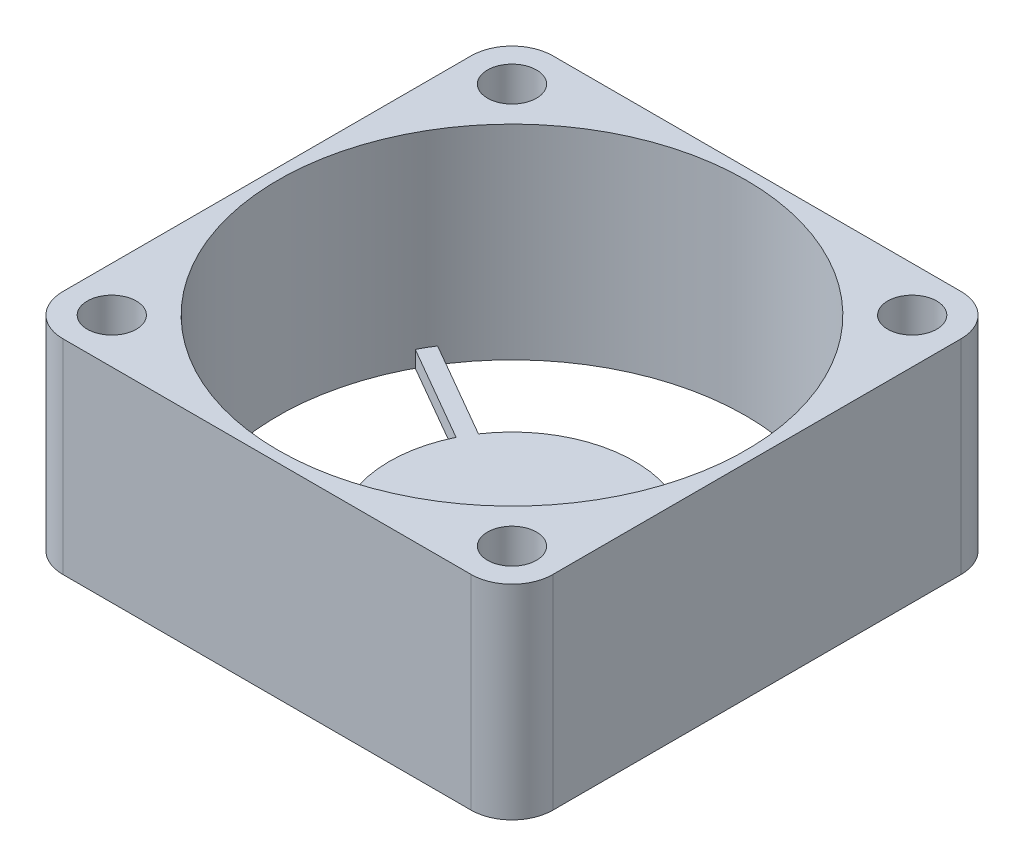
ISO-10303-21;
HEADER;
FILE_DESCRIPTION(('STEP AP214'),'2;1');
FILE_NAME('part.step','',(''),(''),'','','');
FILE_SCHEMA(('AUTOMOTIVE_DESIGN { 1 0 10303 214 1 1 1 1 }'));
ENDSEC;
DATA;
#1=APPLICATION_CONTEXT('core data for automotive mechanical design processes');
#2=APPLICATION_PROTOCOL_DEFINITION('international standard','automotive_design',2000,#1);
#3=PRODUCT_CONTEXT('',#1,'mechanical');
#4=PRODUCT('Part','Part','',(#3));
#5=PRODUCT_RELATED_PRODUCT_CATEGORY('part','',(#4));
#6=PRODUCT_DEFINITION_FORMATION('','',#4);
#7=PRODUCT_DEFINITION_CONTEXT('part definition',#1,'design');
#8=PRODUCT_DEFINITION('design','',#6,#7);
#9=PRODUCT_DEFINITION_SHAPE('','',#8);
#10=(LENGTH_UNIT() NAMED_UNIT(*) SI_UNIT(.MILLI.,.METRE.));
#11=(NAMED_UNIT(*) PLANE_ANGLE_UNIT() SI_UNIT($,.RADIAN.));
#12=(NAMED_UNIT(*) SI_UNIT($,.STERADIAN.) SOLID_ANGLE_UNIT());
#13=UNCERTAINTY_MEASURE_WITH_UNIT(LENGTH_MEASURE(1.E-05),#10,'distance_accuracy_value','');
#14=(GEOMETRIC_REPRESENTATION_CONTEXT(3) GLOBAL_UNCERTAINTY_ASSIGNED_CONTEXT((#13)) GLOBAL_UNIT_ASSIGNED_CONTEXT((#10,
#11,#12)) REPRESENTATION_CONTEXT('',''));
#15=CARTESIAN_POINT('',(0.,0.,0.));
#16=DIRECTION('',(0.,0.,1.));
#17=DIRECTION('',(1.,0.,0.));
#18=AXIS2_PLACEMENT_3D('',#15,#16,#17);
#19=CARTESIAN_POINT('',(0.,35.4678252036913,0.));
#20=DIRECTION('',(0.,-1.,0.));
#21=DIRECTION('',(0.,0.,1.));
#22=AXIS2_PLACEMENT_3D('',#19,#20,#21);
#23=CYLINDRICAL_SURFACE('',#22,14.3241161390704);
#24=CARTESIAN_POINT('',(0.,1.,0.));
#25=DIRECTION('',(0.,-1.,0.));
#26=DIRECTION('',(0.,0.,-1.));
#27=AXIS2_PLACEMENT_3D('',#24,#25,#26);
#28=CIRCLE('',#27,14.3241161390704);
#29=CARTESIAN_POINT('',(0.5,1.,14.3153869373335));
#30=VERTEX_POINT('',#29);
#31=CARTESIAN_POINT('',(-0.5,1.,14.3153869373335));
#32=VERTEX_POINT('',#31);
#33=EDGE_CURVE('E224',#30,#32,#28,.T.);
#34=ORIENTED_EDGE('',*,*,#33,.T.);
#35=DIRECTION('',(0.,-1.,0.));
#36=VECTOR('',#35,1.);
#37=CARTESIAN_POINT('',(-0.5,35.4678252036913,14.3153869373335));
#38=LINE('',#37,#36);
#39=CARTESIAN_POINT('',(-0.5,0.,14.3153869373335));
#40=VERTEX_POINT('',#39);
#41=EDGE_CURVE('E226',#32,#40,#38,.T.);
#42=ORIENTED_EDGE('',*,*,#41,.T.);
#43=CARTESIAN_POINT('',(0.,0.,0.));
#44=DIRECTION('',(0.,-1.,0.));
#45=DIRECTION('',(0.,0.,-1.));
#46=AXIS2_PLACEMENT_3D('',#43,#44,#45);
#47=CIRCLE('',#46,14.3241161390704);
#48=CARTESIAN_POINT('',(0.5,0.,14.3153869373335));
#49=VERTEX_POINT('',#48);
#50=EDGE_CURVE('E204',#49,#40,#47,.T.);
#51=ORIENTED_EDGE('',*,*,#50,.F.);
#52=DIRECTION('',(0.,-1.,0.));
#53=VECTOR('',#52,1.);
#54=CARTESIAN_POINT('',(0.5,35.4678252036913,14.3153869373335));
#55=LINE('',#54,#53);
#56=EDGE_CURVE('E60',#30,#49,#55,.T.);
#57=ORIENTED_EDGE('',*,*,#56,.F.);
#58=EDGE_LOOP('',(#34,#42,#51,#57));
#59=FACE_BOUND('',#58,.T.);
#60=ADVANCED_FACE('F56',(#59),#23,.T.);
#61=CARTESIAN_POINT('',(-0.5,35.4678252036913,0.));
#62=DIRECTION('',(-1.,0.,0.));
#63=DIRECTION('',(0.,0.,-1.));
#64=AXIS2_PLACEMENT_3D('',#61,#62,#63);
#65=PLANE('',#64);
#66=DIRECTION('',(0.,-1.,0.));
#67=VECTOR('',#66,1.);
#68=CARTESIAN_POINT('',(-0.5,35.4678252036913,7.48331477354788));
#69=LINE('',#68,#67);
#70=CARTESIAN_POINT('',(-0.5,1.,7.48331477354788));
#71=VERTEX_POINT('',#70);
#72=CARTESIAN_POINT('',(-0.5,0.,7.48331477354788));
#73=VERTEX_POINT('',#72);
#74=EDGE_CURVE('E202',#71,#73,#69,.T.);
#75=ORIENTED_EDGE('',*,*,#74,.T.);
#76=DIRECTION('',(0.,0.,1.));
#77=VECTOR('',#76,1.);
#78=CARTESIAN_POINT('',(-0.5,0.,0.));
#79=LINE('',#78,#77);
#80=EDGE_CURVE('E128',#73,#40,#79,.T.);
#81=ORIENTED_EDGE('',*,*,#80,.T.);
#82=ORIENTED_EDGE('',*,*,#41,.F.);
#83=DIRECTION('',(0.,0.,1.));
#84=VECTOR('',#83,1.);
#85=CARTESIAN_POINT('',(-0.5,1.,0.));
#86=LINE('',#85,#84);
#87=EDGE_CURVE('E137',#71,#32,#86,.T.);
#88=ORIENTED_EDGE('',*,*,#87,.F.);
#89=EDGE_LOOP('',(#75,#81,#82,#88));
#90=FACE_BOUND('',#89,.T.);
#91=ADVANCED_FACE('F269',(#90),#65,.T.);
#92=CARTESIAN_POINT('',(0.,35.4678252036913,0.));
#93=DIRECTION('',(0.,-1.,0.));
#94=DIRECTION('',(0.,0.,1.));
#95=AXIS2_PLACEMENT_3D('',#92,#93,#94);
#96=CYLINDRICAL_SURFACE('',#95,7.5);
#97=CARTESIAN_POINT('',(0.,1.,0.));
#98=DIRECTION('',(0.,-1.,0.));
#99=DIRECTION('',(0.,0.,-1.));
#100=AXIS2_PLACEMENT_3D('',#97,#98,#99);
#101=CIRCLE('',#100,7.5);
#102=CARTESIAN_POINT('',(-6.73074069840789,1.,-3.30864468488166));
#103=VERTEX_POINT('',#102);
#104=EDGE_CURVE('E221',#71,#103,#101,.T.);
#105=ORIENTED_EDGE('',*,*,#104,.T.);
#106=DIRECTION('',(0.,-1.,0.));
#107=VECTOR('',#106,1.);
#108=CARTESIAN_POINT('',(-6.73074069840789,35.4678252036913,-3.30864468488166));
#109=LINE('',#108,#107);
#110=CARTESIAN_POINT('',(-6.73074069840789,0.,-3.30864468488166));
#111=VERTEX_POINT('',#110);
#112=EDGE_CURVE('E199',#103,#111,#109,.T.);
#113=ORIENTED_EDGE('',*,*,#112,.T.);
#114=CARTESIAN_POINT('',(0.,0.,0.));
#115=DIRECTION('',(0.,-1.,0.));
#116=DIRECTION('',(0.,0.,-1.));
#117=AXIS2_PLACEMENT_3D('',#114,#115,#116);
#118=CIRCLE('',#117,7.5);
#119=EDGE_CURVE('E175',#73,#111,#118,.T.);
#120=ORIENTED_EDGE('',*,*,#119,.F.);
#121=ORIENTED_EDGE('',*,*,#74,.F.);
#122=EDGE_LOOP('',(#105,#113,#120,#121));
#123=FACE_BOUND('',#122,.T.);
#124=ADVANCED_FACE('F268',(#123),#96,.T.);
#125=CARTESIAN_POINT('',(-0.249999999999996,35.4678252036913,0.433012701892222));
#126=DIRECTION('',(0.499999999999992,0.,-0.866025403784443));
#127=DIRECTION('',(0.866025403784443,0.,0.499999999999992));
#128=AXIS2_PLACEMENT_3D('',#125,#126,#127);
#129=PLANE('',#128);
#130=DIRECTION('',(-0.866025403784443,0.,-0.499999999999992));
#131=VECTOR('',#130,1.);
#132=CARTESIAN_POINT('',(-0.249999999999996,1.,0.433012701892222));
#133=LINE('',#132,#131);
#134=CARTESIAN_POINT('',(-12.6474887527348,1.,-6.7246807667744));
#135=VERTEX_POINT('',#134);
#136=EDGE_CURVE('E218',#103,#135,#133,.T.);
#137=ORIENTED_EDGE('',*,*,#136,.T.);
#138=DIRECTION('',(0.,-1.,0.));
#139=VECTOR('',#138,1.);
#140=CARTESIAN_POINT('',(-12.6474887527348,35.4678252036913,-6.7246807667744));
#141=LINE('',#140,#139);
#142=CARTESIAN_POINT('',(-12.6474887527348,0.,-6.7246807667744));
#143=VERTEX_POINT('',#142);
#144=EDGE_CURVE('E196',#135,#143,#141,.T.);
#145=ORIENTED_EDGE('',*,*,#144,.T.);
#146=DIRECTION('',(-0.866025403784443,0.,-0.499999999999992));
#147=VECTOR('',#146,1.);
#148=CARTESIAN_POINT('',(-0.249999999999996,0.,0.433012701892222));
#149=LINE('',#148,#147);
#150=EDGE_CURVE('E197',#111,#143,#149,.T.);
#151=ORIENTED_EDGE('',*,*,#150,.F.);
#152=ORIENTED_EDGE('',*,*,#112,.F.);
#153=EDGE_LOOP('',(#137,#145,#151,#152));
#154=FACE_BOUND('',#153,.T.);
#155=ADVANCED_FACE('F265',(#154),#129,.F.);
#156=CARTESIAN_POINT('',(0.,35.4678252036913,0.));
#157=DIRECTION('',(0.,-1.,0.));
#158=DIRECTION('',(0.,0.,1.));
#159=AXIS2_PLACEMENT_3D('',#156,#157,#158);
#160=CYLINDRICAL_SURFACE('',#159,14.3241161390704);
#161=CARTESIAN_POINT('',(0.,1.,0.));
#162=DIRECTION('',(0.,-1.,0.));
#163=DIRECTION('',(0.,0.,-1.));
#164=AXIS2_PLACEMENT_3D('',#161,#162,#163);
#165=CIRCLE('',#164,14.3241161390704);
#166=CARTESIAN_POINT('',(-12.1474887527348,1.,-7.59070617055884));
#167=VERTEX_POINT('',#166);
#168=EDGE_CURVE('E213',#135,#167,#165,.T.);
#169=ORIENTED_EDGE('',*,*,#168,.T.);
#170=DIRECTION('',(0.,-1.,0.));
#171=VECTOR('',#170,1.);
#172=CARTESIAN_POINT('',(-12.1474887527348,35.4678252036913,-7.59070617055884));
#173=LINE('',#172,#171);
#174=CARTESIAN_POINT('',(-12.1474887527348,0.,-7.59070617055884));
#175=VERTEX_POINT('',#174);
#176=EDGE_CURVE('E215',#167,#175,#173,.T.);
#177=ORIENTED_EDGE('',*,*,#176,.T.);
#178=CARTESIAN_POINT('',(0.,0.,0.));
#179=DIRECTION('',(0.,-1.,0.));
#180=DIRECTION('',(0.,0.,-1.));
#181=AXIS2_PLACEMENT_3D('',#178,#179,#180);
#182=CIRCLE('',#181,14.3241161390704);
#183=EDGE_CURVE('E192',#143,#175,#182,.T.);
#184=ORIENTED_EDGE('',*,*,#183,.F.);
#185=ORIENTED_EDGE('',*,*,#144,.F.);
#186=EDGE_LOOP('',(#169,#177,#184,#185));
#187=FACE_BOUND('',#186,.T.);
#188=ADVANCED_FACE('F262',(#187),#160,.T.);
#189=CARTESIAN_POINT('',(0.249999999999996,35.4678252036913,-0.433012701892222));
#190=DIRECTION('',(0.499999999999992,0.,-0.866025403784443));
#191=DIRECTION('',(0.866025403784443,0.,0.499999999999992));
#192=AXIS2_PLACEMENT_3D('',#189,#190,#191);
#193=PLANE('',#192);
#194=DIRECTION('',(0.,-1.,0.));
#195=VECTOR('',#194,1.);
#196=CARTESIAN_POINT('',(-6.2307406984079,35.4678252036913,-4.1746700886661));
#197=LINE('',#196,#195);
#198=CARTESIAN_POINT('',(-6.2307406984079,1.,-4.1746700886661));
#199=VERTEX_POINT('',#198);
#200=CARTESIAN_POINT('',(-6.2307406984079,0.,-4.1746700886661));
#201=VERTEX_POINT('',#200);
#202=EDGE_CURVE('E239',#199,#201,#197,.T.);
#203=ORIENTED_EDGE('',*,*,#202,.T.);
#204=DIRECTION('',(-0.866025403784443,0.,-0.499999999999992));
#205=VECTOR('',#204,1.);
#206=CARTESIAN_POINT('',(0.249999999999996,0.,-0.433012701892222));
#207=LINE('',#206,#205);
#208=EDGE_CURVE('E181',#201,#175,#207,.T.);
#209=ORIENTED_EDGE('',*,*,#208,.T.);
#210=ORIENTED_EDGE('',*,*,#176,.F.);
#211=DIRECTION('',(-0.866025403784443,0.,-0.499999999999992));
#212=VECTOR('',#211,1.);
#213=CARTESIAN_POINT('',(0.249999999999996,1.,-0.433012701892222));
#214=LINE('',#213,#212);
#215=EDGE_CURVE('E195',#199,#167,#214,.T.);
#216=ORIENTED_EDGE('',*,*,#215,.F.);
#217=EDGE_LOOP('',(#203,#209,#210,#216));
#218=FACE_BOUND('',#217,.T.);
#219=ADVANCED_FACE('F259',(#218),#193,.T.);
#220=CARTESIAN_POINT('',(0.,1.,0.));
#221=DIRECTION('',(0.,-1.,0.));
#222=DIRECTION('',(0.,0.,-1.));
#223=AXIS2_PLACEMENT_3D('',#220,#221,#222);
#224=CIRCLE('',#223,7.5);
#225=CARTESIAN_POINT('',(6.23074069840784,1.,-4.17467008866619));
#226=VERTEX_POINT('',#225);
#227=EDGE_CURVE('E210',#199,#226,#224,.T.);
#228=ORIENTED_EDGE('',*,*,#227,.T.);
#229=DIRECTION('',(0.,-1.,0.));
#230=VECTOR('',#229,1.);
#231=CARTESIAN_POINT('',(6.23074069840784,35.4678252036913,-4.17467008866619));
#232=LINE('',#231,#230);
#233=CARTESIAN_POINT('',(6.23074069840784,0.,-4.17467008866619));
#234=VERTEX_POINT('',#233);
#235=EDGE_CURVE('E190',#226,#234,#232,.T.);
#236=ORIENTED_EDGE('',*,*,#235,.T.);
#237=EDGE_CURVE('E174',#201,#234,#118,.T.);
#238=ORIENTED_EDGE('',*,*,#237,.F.);
#239=ORIENTED_EDGE('',*,*,#202,.F.);
#240=EDGE_LOOP('',(#228,#236,#238,#239));
#241=FACE_BOUND('',#240,.T.);
#242=ADVANCED_FACE('F255',(#241),#96,.T.);
#243=CARTESIAN_POINT('',(-0.250000000000002,35.4678252036913,-0.433012701892218));
#244=DIRECTION('',(0.500000000000004,0.,0.866025403784436));
#245=DIRECTION('',(-0.866025403784436,0.,0.500000000000004));
#246=AXIS2_PLACEMENT_3D('',#243,#244,#245);
#247=PLANE('',#246);
#248=DIRECTION('',(0.866025403784436,0.,-0.500000000000004));
#249=VECTOR('',#248,1.);
#250=CARTESIAN_POINT('',(-0.250000000000002,1.,-0.433012701892218));
#251=LINE('',#250,#249);
#252=CARTESIAN_POINT('',(12.1474887527347,1.,-7.59070617055901));
#253=VERTEX_POINT('',#252);
#254=EDGE_CURVE('E207',#226,#253,#251,.T.);
#255=ORIENTED_EDGE('',*,*,#254,.T.);
#256=DIRECTION('',(0.,-1.,0.));
#257=VECTOR('',#256,1.);
#258=CARTESIAN_POINT('',(12.1474887527347,35.4678252036913,-7.59070617055901));
#259=LINE('',#258,#257);
#260=CARTESIAN_POINT('',(12.1474887527347,0.,-7.59070617055901));
#261=VERTEX_POINT('',#260);
#262=EDGE_CURVE('E186',#253,#261,#259,.T.);
#263=ORIENTED_EDGE('',*,*,#262,.T.);
#264=DIRECTION('',(0.866025403784436,0.,-0.500000000000004));
#265=VECTOR('',#264,1.);
#266=CARTESIAN_POINT('',(-0.250000000000002,0.,-0.433012701892218));
#267=LINE('',#266,#265);
#268=EDGE_CURVE('E187',#234,#261,#267,.T.);
#269=ORIENTED_EDGE('',*,*,#268,.F.);
#270=ORIENTED_EDGE('',*,*,#235,.F.);
#271=EDGE_LOOP('',(#255,#263,#269,#270));
#272=FACE_BOUND('',#271,.T.);
#273=ADVANCED_FACE('F246',(#272),#247,.F.);
#274=CARTESIAN_POINT('',(0.,35.4678252036913,0.));
#275=DIRECTION('',(0.,-1.,0.));
#276=DIRECTION('',(0.,0.,1.));
#277=AXIS2_PLACEMENT_3D('',#274,#275,#276);
#278=CYLINDRICAL_SURFACE('',#277,14.3241161390704);
#279=CARTESIAN_POINT('',(0.,1.,0.));
#280=DIRECTION('',(0.,-1.,0.));
#281=DIRECTION('',(0.,0.,-1.));
#282=AXIS2_PLACEMENT_3D('',#279,#280,#281);
#283=CIRCLE('',#282,14.3241161390704);
#284=CARTESIAN_POINT('',(12.6474887527347,1.,-6.72468076677458));
#285=VERTEX_POINT('',#284);
#286=EDGE_CURVE('E65',#253,#285,#283,.T.);
#287=ORIENTED_EDGE('',*,*,#286,.T.);
#288=DIRECTION('',(0.,-1.,0.));
#289=VECTOR('',#288,1.);
#290=CARTESIAN_POINT('',(12.6474887527347,35.4678252036913,-6.72468076677458));
#291=LINE('',#290,#289);
#292=CARTESIAN_POINT('',(12.6474887527347,0.,-6.72468076677458));
#293=VERTEX_POINT('',#292);
#294=EDGE_CURVE('E164',#285,#293,#291,.T.);
#295=ORIENTED_EDGE('',*,*,#294,.T.);
#296=CARTESIAN_POINT('',(0.,0.,0.));
#297=DIRECTION('',(0.,-1.,0.));
#298=DIRECTION('',(0.,0.,-1.));
#299=AXIS2_PLACEMENT_3D('',#296,#297,#298);
#300=CIRCLE('',#299,14.3241161390704);
#301=EDGE_CURVE('E166',#261,#293,#300,.T.);
#302=ORIENTED_EDGE('',*,*,#301,.F.);
#303=ORIENTED_EDGE('',*,*,#262,.F.);
#304=EDGE_LOOP('',(#287,#295,#302,#303));
#305=FACE_BOUND('',#304,.T.);
#306=ADVANCED_FACE('F250',(#305),#278,.T.);
#307=CARTESIAN_POINT('',(0.250000000000003,35.4678252036913,0.433012701892219));
#308=DIRECTION('',(0.500000000000004,0.,0.866025403784436));
#309=DIRECTION('',(-0.866025403784436,0.,0.500000000000004));
#310=AXIS2_PLACEMENT_3D('',#307,#308,#309);
#311=PLANE('',#310);
#312=DIRECTION('',(0.,-1.,0.));
#313=VECTOR('',#312,1.);
#314=CARTESIAN_POINT('',(6.73074069840785,35.4678252036913,-3.30864468488175));
#315=LINE('',#314,#313);
#316=CARTESIAN_POINT('',(6.73074069840785,1.,-3.30864468488175));
#317=VERTEX_POINT('',#316);
#318=CARTESIAN_POINT('',(6.73074069840785,0.,-3.30864468488175));
#319=VERTEX_POINT('',#318);
#320=EDGE_CURVE('E162',#317,#319,#315,.T.);
#321=ORIENTED_EDGE('',*,*,#320,.T.);
#322=DIRECTION('',(0.866025403784436,0.,-0.500000000000004));
#323=VECTOR('',#322,1.);
#324=CARTESIAN_POINT('',(0.250000000000003,0.,0.433012701892219));
#325=LINE('',#324,#323);
#326=EDGE_CURVE('E178',#319,#293,#325,.T.);
#327=ORIENTED_EDGE('',*,*,#326,.T.);
#328=ORIENTED_EDGE('',*,*,#294,.F.);
#329=DIRECTION('',(0.866025403784436,0.,-0.500000000000004));
#330=VECTOR('',#329,1.);
#331=CARTESIAN_POINT('',(0.250000000000003,1.,0.433012701892219));
#332=LINE('',#331,#330);
#333=EDGE_CURVE('E154',#317,#285,#332,.T.);
#334=ORIENTED_EDGE('',*,*,#333,.F.);
#335=EDGE_LOOP('',(#321,#327,#328,#334));
#336=FACE_BOUND('',#335,.T.);
#337=ADVANCED_FACE('F161',(#336),#311,.T.);
#338=CARTESIAN_POINT('',(0.,1.,0.));
#339=DIRECTION('',(0.,-1.,0.));
#340=DIRECTION('',(0.,0.,-1.));
#341=AXIS2_PLACEMENT_3D('',#338,#339,#340);
#342=CIRCLE('',#341,7.5);
#343=CARTESIAN_POINT('',(0.5,1.,7.48331477354788));
#344=VERTEX_POINT('',#343);
#345=EDGE_CURVE('E12',#317,#344,#342,.T.);
#346=ORIENTED_EDGE('',*,*,#345,.T.);
#347=DIRECTION('',(0.,-1.,0.));
#348=VECTOR('',#347,1.);
#349=CARTESIAN_POINT('',(0.5,35.4678252036913,7.48331477354788));
#350=LINE('',#349,#348);
#351=CARTESIAN_POINT('',(0.5,0.,7.48331477354788));
#352=VERTEX_POINT('',#351);
#353=EDGE_CURVE('E172',#344,#352,#350,.T.);
#354=ORIENTED_EDGE('',*,*,#353,.T.);
#355=EDGE_CURVE('E169',#319,#352,#118,.T.);
#356=ORIENTED_EDGE('',*,*,#355,.F.);
#357=ORIENTED_EDGE('',*,*,#320,.F.);
#358=EDGE_LOOP('',(#346,#354,#356,#357));
#359=FACE_BOUND('',#358,.T.);
#360=ADVANCED_FACE('F168',(#359),#96,.T.);
#361=CARTESIAN_POINT('',(0.5,35.4678252036913,0.));
#362=DIRECTION('',(-1.,0.,0.));
#363=DIRECTION('',(0.,0.,-1.));
#364=AXIS2_PLACEMENT_3D('',#361,#362,#363);
#365=PLANE('',#364);
#366=DIRECTION('',(0.,0.,1.));
#367=VECTOR('',#366,1.);
#368=CARTESIAN_POINT('',(0.5,1.,0.));
#369=LINE('',#368,#367);
#370=EDGE_CURVE('E73',#344,#30,#369,.T.);
#371=ORIENTED_EDGE('',*,*,#370,.T.);
#372=ORIENTED_EDGE('',*,*,#56,.T.);
#373=DIRECTION('',(0.,0.,1.));
#374=VECTOR('',#373,1.);
#375=CARTESIAN_POINT('',(0.5,0.,0.));
#376=LINE('',#375,#374);
#377=EDGE_CURVE('E79',#352,#49,#376,.T.);
#378=ORIENTED_EDGE('',*,*,#377,.F.);
#379=ORIENTED_EDGE('',*,*,#353,.F.);
#380=EDGE_LOOP('',(#371,#372,#378,#379));
#381=FACE_BOUND('',#380,.T.);
#382=ADVANCED_FACE('F272',(#381),#365,.F.);
#383=CARTESIAN_POINT('',(0.,0.,0.));
#384=DIRECTION('',(0.,1.,0.));
#385=DIRECTION('',(0.,0.,-1.));
#386=AXIS2_PLACEMENT_3D('',#383,#384,#385);
#387=PLANE('',#386);
#388=ORIENTED_EDGE('',*,*,#50,.T.);
#389=ORIENTED_EDGE('',*,*,#80,.F.);
#390=ORIENTED_EDGE('',*,*,#119,.T.);
#391=ORIENTED_EDGE('',*,*,#150,.T.);
#392=ORIENTED_EDGE('',*,*,#183,.T.);
#393=ORIENTED_EDGE('',*,*,#208,.F.);
#394=ORIENTED_EDGE('',*,*,#237,.T.);
#395=ORIENTED_EDGE('',*,*,#268,.T.);
#396=ORIENTED_EDGE('',*,*,#301,.T.);
#397=ORIENTED_EDGE('',*,*,#326,.F.);
#398=ORIENTED_EDGE('',*,*,#355,.T.);
#399=ORIENTED_EDGE('',*,*,#377,.T.);
#400=EDGE_LOOP('',(#388,#389,#390,#391,#392,#393,#394,#395,#396,#397,#398,#399));
#401=FACE_BOUND('',#400,.T.);
#402=ADVANCED_FACE('F251',(#401),#387,.F.);
#403=CARTESIAN_POINT('',(0.,1.,0.));
#404=DIRECTION('',(0.,1.,0.));
#405=DIRECTION('',(0.,0.,-1.));
#406=AXIS2_PLACEMENT_3D('',#403,#404,#405);
#407=PLANE('',#406);
#408=ORIENTED_EDGE('',*,*,#370,.F.);
#409=ORIENTED_EDGE('',*,*,#345,.F.);
#410=ORIENTED_EDGE('',*,*,#333,.T.);
#411=ORIENTED_EDGE('',*,*,#286,.F.);
#412=ORIENTED_EDGE('',*,*,#254,.F.);
#413=ORIENTED_EDGE('',*,*,#227,.F.);
#414=ORIENTED_EDGE('',*,*,#215,.T.);
#415=ORIENTED_EDGE('',*,*,#168,.F.);
#416=ORIENTED_EDGE('',*,*,#136,.F.);
#417=ORIENTED_EDGE('',*,*,#104,.F.);
#418=ORIENTED_EDGE('',*,*,#87,.T.);
#419=ORIENTED_EDGE('',*,*,#33,.F.);
#420=EDGE_LOOP('',(#408,#409,#410,#411,#412,#413,#414,#415,#416,#417,#418,#419));
#421=FACE_BOUND('',#420,.T.);
#422=ADVANCED_FACE('F58',(#421),#407,.T.);
#423=CLOSED_SHELL('',(#60,#91,#124,#155,#188,#219,#242,#273,#306,#337,#360,#382,#402,#422));
#424=MANIFOLD_SOLID_BREP('B2',#423);
#425=CARTESIAN_POINT('',(15.,12.5,0.));
#426=DIRECTION('',(1.,0.,0.));
#427=DIRECTION('',(0.,0.,1.));
#428=AXIS2_PLACEMENT_3D('',#425,#426,#427);
#429=PLANE('',#428);
#430=DIRECTION('',(0.,0.,-1.));
#431=VECTOR('',#430,1.);
#432=CARTESIAN_POINT('',(15.,0.,0.));
#433=LINE('',#432,#431);
#434=CARTESIAN_POINT('',(15.,0.,12.5));
#435=VERTEX_POINT('',#434);
#436=CARTESIAN_POINT('',(15.,0.,-12.5));
#437=VERTEX_POINT('',#436);
#438=EDGE_CURVE('E502',#435,#437,#433,.T.);
#439=ORIENTED_EDGE('',*,*,#438,.T.);
#440=DIRECTION('',(0.,-1.,0.));
#441=VECTOR('',#440,1.);
#442=CARTESIAN_POINT('',(15.,0.,-12.5));
#443=LINE('',#442,#441);
#444=CARTESIAN_POINT('',(15.,12.5,-12.5));
#445=VERTEX_POINT('',#444);
#446=EDGE_CURVE('E521',#445,#437,#443,.T.);
#447=ORIENTED_EDGE('',*,*,#446,.F.);
#448=DIRECTION('',(0.,0.,-1.));
#449=VECTOR('',#448,1.);
#450=CARTESIAN_POINT('',(15.,12.5,0.));
#451=LINE('',#450,#449);
#452=CARTESIAN_POINT('',(15.,12.5,12.5));
#453=VERTEX_POINT('',#452);
#454=EDGE_CURVE('E729',#453,#445,#451,.T.);
#455=ORIENTED_EDGE('',*,*,#454,.F.);
#456=DIRECTION('',(0.,-1.,0.));
#457=VECTOR('',#456,1.);
#458=CARTESIAN_POINT('',(15.,12.5,12.5));
#459=LINE('',#458,#457);
#460=EDGE_CURVE('E524',#435,#453,#459,.F.);
#461=ORIENTED_EDGE('',*,*,#460,.F.);
#462=EDGE_LOOP('',(#439,#447,#455,#461));
#463=FACE_BOUND('',#462,.T.);
#464=ADVANCED_FACE('F406',(#463),#429,.T.);
#465=CARTESIAN_POINT('',(0.,12.5,15.));
#466=DIRECTION('',(0.,0.,1.));
#467=DIRECTION('',(-1.,0.,0.));
#468=AXIS2_PLACEMENT_3D('',#465,#466,#467);
#469=PLANE('',#468);
#470=DIRECTION('',(1.,0.,0.));
#471=VECTOR('',#470,1.);
#472=CARTESIAN_POINT('',(0.,0.,15.));
#473=LINE('',#472,#471);
#474=CARTESIAN_POINT('',(-12.5,0.,15.));
#475=VERTEX_POINT('',#474);
#476=CARTESIAN_POINT('',(12.5,0.,15.));
#477=VERTEX_POINT('',#476);
#478=EDGE_CURVE('E479',#475,#477,#473,.T.);
#479=ORIENTED_EDGE('',*,*,#478,.T.);
#480=DIRECTION('',(0.,-1.,0.));
#481=VECTOR('',#480,1.);
#482=CARTESIAN_POINT('',(12.5,12.5,15.));
#483=LINE('',#482,#481);
#484=CARTESIAN_POINT('',(12.5,12.5,15.));
#485=VERTEX_POINT('',#484);
#486=EDGE_CURVE('E483',#485,#477,#483,.T.);
#487=ORIENTED_EDGE('',*,*,#486,.F.);
#488=DIRECTION('',(1.,0.,0.));
#489=VECTOR('',#488,1.);
#490=CARTESIAN_POINT('',(0.,12.5,15.));
#491=LINE('',#490,#489);
#492=CARTESIAN_POINT('',(-12.5,12.5,15.));
#493=VERTEX_POINT('',#492);
#494=EDGE_CURVE('E534',#493,#485,#491,.T.);
#495=ORIENTED_EDGE('',*,*,#494,.F.);
#496=DIRECTION('',(0.,-1.,0.));
#497=VECTOR('',#496,1.);
#498=CARTESIAN_POINT('',(-12.5,12.5,15.));
#499=LINE('',#498,#497);
#500=EDGE_CURVE('E514',#475,#493,#499,.F.);
#501=ORIENTED_EDGE('',*,*,#500,.F.);
#502=EDGE_LOOP('',(#479,#487,#495,#501));
#503=FACE_BOUND('',#502,.T.);
#504=ADVANCED_FACE('F568',(#503),#469,.T.);
#505=CARTESIAN_POINT('',(-15.,12.5,0.));
#506=DIRECTION('',(1.,0.,0.));
#507=DIRECTION('',(0.,0.,1.));
#508=AXIS2_PLACEMENT_3D('',#505,#506,#507);
#509=PLANE('',#508);
#510=DIRECTION('',(0.,0.,-1.));
#511=VECTOR('',#510,1.);
#512=CARTESIAN_POINT('',(-15.,12.5,0.));
#513=LINE('',#512,#511);
#514=CARTESIAN_POINT('',(-15.,12.5,12.5));
#515=VERTEX_POINT('',#514);
#516=CARTESIAN_POINT('',(-15.,12.5,-12.5));
#517=VERTEX_POINT('',#516);
#518=EDGE_CURVE('E532',#515,#517,#513,.T.);
#519=ORIENTED_EDGE('',*,*,#518,.T.);
#520=DIRECTION('',(0.,-1.,0.));
#521=VECTOR('',#520,1.);
#522=CARTESIAN_POINT('',(-15.,12.5,-12.5));
#523=LINE('',#522,#521);
#524=CARTESIAN_POINT('',(-15.,0.,-12.5));
#525=VERTEX_POINT('',#524);
#526=EDGE_CURVE('E494',#525,#517,#523,.F.);
#527=ORIENTED_EDGE('',*,*,#526,.F.);
#528=DIRECTION('',(0.,0.,-1.));
#529=VECTOR('',#528,1.);
#530=CARTESIAN_POINT('',(-15.,0.,0.));
#531=LINE('',#530,#529);
#532=CARTESIAN_POINT('',(-15.,0.,12.5));
#533=VERTEX_POINT('',#532);
#534=EDGE_CURVE('E476',#533,#525,#531,.T.);
#535=ORIENTED_EDGE('',*,*,#534,.F.);
#536=DIRECTION('',(0.,-1.,0.));
#537=VECTOR('',#536,1.);
#538=CARTESIAN_POINT('',(-15.,0.,12.5));
#539=LINE('',#538,#537);
#540=EDGE_CURVE('E487',#515,#533,#539,.T.);
#541=ORIENTED_EDGE('',*,*,#540,.F.);
#542=EDGE_LOOP('',(#519,#527,#535,#541));
#543=FACE_BOUND('',#542,.T.);
#544=ADVANCED_FACE('F496',(#543),#509,.F.);
#545=CARTESIAN_POINT('',(12.25,12.5,12.25));
#546=DIRECTION('',(0.,-1.,0.));
#547=DIRECTION('',(0.,0.,1.));
#548=AXIS2_PLACEMENT_3D('',#545,#546,#547);
#549=CYLINDRICAL_SURFACE('',#548,1.5);
#550=CARTESIAN_POINT('',(12.25,12.5,12.25));
#551=DIRECTION('',(0.,-1.,0.));
#552=DIRECTION('',(0.,0.,-1.));
#553=AXIS2_PLACEMENT_3D('',#550,#551,#552);
#554=CIRCLE('',#553,1.5);
#555=CARTESIAN_POINT('',(12.25,12.5,10.75));
#556=VERTEX_POINT('',#555);
#557=EDGE_CURVE('E725',#556,#556,#554,.T.);
#558=ORIENTED_EDGE('',*,*,#557,.F.);
#559=EDGE_LOOP('',(#558));
#560=FACE_BOUND('',#559,.T.);
#561=CARTESIAN_POINT('',(12.25,0.,12.25));
#562=DIRECTION('',(0.,-1.,0.));
#563=DIRECTION('',(0.,0.,-1.));
#564=AXIS2_PLACEMENT_3D('',#561,#562,#563);
#565=CIRCLE('',#564,1.5);
#566=CARTESIAN_POINT('',(12.25,0.,10.75));
#567=VERTEX_POINT('',#566);
#568=EDGE_CURVE('E550',#567,#567,#565,.T.);
#569=ORIENTED_EDGE('',*,*,#568,.T.);
#570=EDGE_LOOP('',(#569));
#571=FACE_BOUND('',#570,.T.);
#572=ADVANCED_FACE('F577',(#560,#571),#549,.F.);
#573=CARTESIAN_POINT('',(12.25,12.5,-12.25));
#574=DIRECTION('',(0.,-1.,0.));
#575=DIRECTION('',(0.,0.,1.));
#576=AXIS2_PLACEMENT_3D('',#573,#574,#575);
#577=CYLINDRICAL_SURFACE('',#576,1.5);
#578=CARTESIAN_POINT('',(12.25,12.5,-12.25));
#579=DIRECTION('',(0.,-1.,0.));
#580=DIRECTION('',(0.,0.,-1.));
#581=AXIS2_PLACEMENT_3D('',#578,#579,#580);
#582=CIRCLE('',#581,1.5);
#583=CARTESIAN_POINT('',(12.25,12.5,-13.75));
#584=VERTEX_POINT('',#583);
#585=EDGE_CURVE('E722',#584,#584,#582,.T.);
#586=ORIENTED_EDGE('',*,*,#585,.F.);
#587=EDGE_LOOP('',(#586));
#588=FACE_BOUND('',#587,.T.);
#589=CARTESIAN_POINT('',(12.25,0.,-12.25));
#590=DIRECTION('',(0.,-1.,0.));
#591=DIRECTION('',(0.,0.,-1.));
#592=AXIS2_PLACEMENT_3D('',#589,#590,#591);
#593=CIRCLE('',#592,1.5);
#594=CARTESIAN_POINT('',(12.25,0.,-13.75));
#595=VERTEX_POINT('',#594);
#596=EDGE_CURVE('E547',#595,#595,#593,.T.);
#597=ORIENTED_EDGE('',*,*,#596,.T.);
#598=EDGE_LOOP('',(#597));
#599=FACE_BOUND('',#598,.T.);
#600=ADVANCED_FACE('F580',(#588,#599),#577,.F.);
#601=CARTESIAN_POINT('',(-12.25,12.5,12.25));
#602=DIRECTION('',(0.,-1.,0.));
#603=DIRECTION('',(0.,0.,1.));
#604=AXIS2_PLACEMENT_3D('',#601,#602,#603);
#605=CYLINDRICAL_SURFACE('',#604,1.5);
#606=CARTESIAN_POINT('',(-12.25,12.5,12.25));
#607=DIRECTION('',(0.,-1.,0.));
#608=DIRECTION('',(0.,0.,-1.));
#609=AXIS2_PLACEMENT_3D('',#606,#607,#608);
#610=CIRCLE('',#609,1.5);
#611=CARTESIAN_POINT('',(-12.25,12.5,10.75));
#612=VERTEX_POINT('',#611);
#613=EDGE_CURVE('E718',#612,#612,#610,.T.);
#614=ORIENTED_EDGE('',*,*,#613,.F.);
#615=EDGE_LOOP('',(#614));
#616=FACE_BOUND('',#615,.T.);
#617=CARTESIAN_POINT('',(-12.25,0.,12.25));
#618=DIRECTION('',(0.,-1.,0.));
#619=DIRECTION('',(0.,0.,-1.));
#620=AXIS2_PLACEMENT_3D('',#617,#618,#619);
#621=CIRCLE('',#620,1.5);
#622=CARTESIAN_POINT('',(-12.25,0.,10.75));
#623=VERTEX_POINT('',#622);
#624=EDGE_CURVE('E544',#623,#623,#621,.T.);
#625=ORIENTED_EDGE('',*,*,#624,.T.);
#626=EDGE_LOOP('',(#625));
#627=FACE_BOUND('',#626,.T.);
#628=ADVANCED_FACE('F584',(#616,#627),#605,.F.);
#629=CARTESIAN_POINT('',(-12.25,12.5,-12.25));
#630=DIRECTION('',(0.,-1.,0.));
#631=DIRECTION('',(0.,0.,1.));
#632=AXIS2_PLACEMENT_3D('',#629,#630,#631);
#633=CYLINDRICAL_SURFACE('',#632,1.5);
#634=CARTESIAN_POINT('',(-12.25,12.5,-12.25));
#635=DIRECTION('',(0.,-1.,0.));
#636=DIRECTION('',(0.,0.,-1.));
#637=AXIS2_PLACEMENT_3D('',#634,#635,#636);
#638=CIRCLE('',#637,1.5);
#639=CARTESIAN_POINT('',(-12.25,12.5,-13.75));
#640=VERTEX_POINT('',#639);
#641=EDGE_CURVE('E714',#640,#640,#638,.T.);
#642=ORIENTED_EDGE('',*,*,#641,.F.);
#643=EDGE_LOOP('',(#642));
#644=FACE_BOUND('',#643,.T.);
#645=CARTESIAN_POINT('',(-12.25,0.,-12.25));
#646=DIRECTION('',(0.,-1.,0.));
#647=DIRECTION('',(0.,0.,-1.));
#648=AXIS2_PLACEMENT_3D('',#645,#646,#647);
#649=CIRCLE('',#648,1.5);
#650=CARTESIAN_POINT('',(-12.25,0.,-13.75));
#651=VERTEX_POINT('',#650);
#652=EDGE_CURVE('E541',#651,#651,#649,.T.);
#653=ORIENTED_EDGE('',*,*,#652,.T.);
#654=EDGE_LOOP('',(#653));
#655=FACE_BOUND('',#654,.T.);
#656=ADVANCED_FACE('F588',(#644,#655),#633,.F.);
#657=CARTESIAN_POINT('',(0.,12.5,0.));
#658=DIRECTION('',(0.,-1.,0.));
#659=DIRECTION('',(0.,0.,1.));
#660=AXIS2_PLACEMENT_3D('',#657,#658,#659);
#661=CYLINDRICAL_SURFACE('',#660,14.3241161390704);
#662=CARTESIAN_POINT('',(0.,12.5,0.));
#663=DIRECTION('',(0.,-1.,0.));
#664=DIRECTION('',(0.,0.,-1.));
#665=AXIS2_PLACEMENT_3D('',#662,#663,#664);
#666=CIRCLE('',#665,14.3241161390704);
#667=CARTESIAN_POINT('',(0.,12.5,-14.3241161390704));
#668=VERTEX_POINT('',#667);
#669=EDGE_CURVE('E500',#668,#668,#666,.T.);
#670=ORIENTED_EDGE('',*,*,#669,.F.);
#671=EDGE_LOOP('',(#670));
#672=FACE_BOUND('',#671,.T.);
#673=CARTESIAN_POINT('',(0.,0.,0.));
#674=DIRECTION('',(0.,-1.,0.));
#675=DIRECTION('',(0.,0.,-1.));
#676=AXIS2_PLACEMENT_3D('',#673,#674,#675);
#677=CIRCLE('',#676,14.3241161390704);
#678=CARTESIAN_POINT('',(0.,0.,-14.3241161390704));
#679=VERTEX_POINT('',#678);
#680=EDGE_CURVE('E538',#679,#679,#677,.T.);
#681=ORIENTED_EDGE('',*,*,#680,.T.);
#682=EDGE_LOOP('',(#681));
#683=FACE_BOUND('',#682,.T.);
#684=ADVANCED_FACE('F592',(#672,#683),#661,.F.);
#685=CARTESIAN_POINT('',(0.,12.5,-15.));
#686=DIRECTION('',(0.,0.,1.));
#687=DIRECTION('',(-1.,0.,0.));
#688=AXIS2_PLACEMENT_3D('',#685,#686,#687);
#689=PLANE('',#688);
#690=DIRECTION('',(1.,0.,0.));
#691=VECTOR('',#690,1.);
#692=CARTESIAN_POINT('',(0.,12.5,-15.));
#693=LINE('',#692,#691);
#694=CARTESIAN_POINT('',(-12.5,12.5,-15.));
#695=VERTEX_POINT('',#694);
#696=CARTESIAN_POINT('',(12.5,12.5,-15.));
#697=VERTEX_POINT('',#696);
#698=EDGE_CURVE('E506',#695,#697,#693,.T.);
#699=ORIENTED_EDGE('',*,*,#698,.T.);
#700=DIRECTION('',(0.,-1.,0.));
#701=VECTOR('',#700,1.);
#702=CARTESIAN_POINT('',(12.5,12.5,-15.));
#703=LINE('',#702,#701);
#704=CARTESIAN_POINT('',(12.5,0.,-15.));
#705=VERTEX_POINT('',#704);
#706=EDGE_CURVE('E414',#705,#697,#703,.F.);
#707=ORIENTED_EDGE('',*,*,#706,.F.);
#708=DIRECTION('',(1.,0.,0.));
#709=VECTOR('',#708,1.);
#710=CARTESIAN_POINT('',(0.,0.,-15.));
#711=LINE('',#710,#709);
#712=CARTESIAN_POINT('',(-12.5,0.,-15.));
#713=VERTEX_POINT('',#712);
#714=EDGE_CURVE('E497',#713,#705,#711,.T.);
#715=ORIENTED_EDGE('',*,*,#714,.F.);
#716=DIRECTION('',(0.,-1.,0.));
#717=VECTOR('',#716,1.);
#718=CARTESIAN_POINT('',(-12.5,12.5,-15.));
#719=LINE('',#718,#717);
#720=EDGE_CURVE('E54',#695,#713,#719,.T.);
#721=ORIENTED_EDGE('',*,*,#720,.F.);
#722=EDGE_LOOP('',(#699,#707,#715,#721));
#723=FACE_BOUND('',#722,.T.);
#724=ADVANCED_FACE('F531',(#723),#689,.F.);
#725=CARTESIAN_POINT('',(0.,12.5,0.));
#726=DIRECTION('',(0.,1.,0.));
#727=DIRECTION('',(0.,0.,-1.));
#728=AXIS2_PLACEMENT_3D('',#725,#726,#727);
#729=PLANE('',#728);
#730=ORIENTED_EDGE('',*,*,#669,.T.);
#731=EDGE_LOOP('',(#730));
#732=FACE_BOUND('',#731,.T.);
#733=ORIENTED_EDGE('',*,*,#641,.T.);
#734=EDGE_LOOP('',(#733));
#735=FACE_BOUND('',#734,.T.);
#736=ORIENTED_EDGE('',*,*,#613,.T.);
#737=EDGE_LOOP('',(#736));
#738=FACE_BOUND('',#737,.T.);
#739=ORIENTED_EDGE('',*,*,#585,.T.);
#740=EDGE_LOOP('',(#739));
#741=FACE_BOUND('',#740,.T.);
#742=ORIENTED_EDGE('',*,*,#557,.T.);
#743=EDGE_LOOP('',(#742));
#744=FACE_BOUND('',#743,.T.);
#745=ORIENTED_EDGE('',*,*,#494,.T.);
#746=CARTESIAN_POINT('',(12.5,12.5,12.5));
#747=DIRECTION('',(0.,-1.,0.));
#748=DIRECTION('',(0.,0.,-1.));
#749=AXIS2_PLACEMENT_3D('',#746,#747,#748);
#750=CIRCLE('',#749,2.5);
#751=EDGE_CURVE('E518',#453,#485,#750,.T.);
#752=ORIENTED_EDGE('',*,*,#751,.F.);
#753=ORIENTED_EDGE('',*,*,#454,.T.);
#754=CARTESIAN_POINT('',(12.5,12.5,-12.5));
#755=DIRECTION('',(0.,-1.,0.));
#756=DIRECTION('',(0.,0.,-1.));
#757=AXIS2_PLACEMENT_3D('',#754,#755,#756);
#758=CIRCLE('',#757,2.5);
#759=EDGE_CURVE('E421',#697,#445,#758,.T.);
#760=ORIENTED_EDGE('',*,*,#759,.F.);
#761=ORIENTED_EDGE('',*,*,#698,.F.);
#762=CARTESIAN_POINT('',(-12.5,12.5,-12.5));
#763=DIRECTION('',(0.,-1.,0.));
#764=DIRECTION('',(0.,0.,-1.));
#765=AXIS2_PLACEMENT_3D('',#762,#763,#764);
#766=CIRCLE('',#765,2.5);
#767=EDGE_CURVE('E428',#517,#695,#766,.T.);
#768=ORIENTED_EDGE('',*,*,#767,.F.);
#769=ORIENTED_EDGE('',*,*,#518,.F.);
#770=CARTESIAN_POINT('',(-12.5,12.5,12.5));
#771=DIRECTION('',(0.,-1.,0.));
#772=DIRECTION('',(0.,0.,-1.));
#773=AXIS2_PLACEMENT_3D('',#770,#771,#772);
#774=CIRCLE('',#773,2.5);
#775=EDGE_CURVE('E489',#493,#515,#774,.T.);
#776=ORIENTED_EDGE('',*,*,#775,.F.);
#777=EDGE_LOOP('',(#745,#752,#753,#760,#761,#768,#769,#776));
#778=FACE_BOUND('',#777,.T.);
#779=ADVANCED_FACE('F601',(#732,#735,#738,#741,#744,#778),#729,.T.);
#780=CARTESIAN_POINT('',(0.,0.,0.));
#781=DIRECTION('',(0.,1.,0.));
#782=DIRECTION('',(0.,0.,-1.));
#783=AXIS2_PLACEMENT_3D('',#780,#781,#782);
#784=PLANE('',#783);
#785=ORIENTED_EDGE('',*,*,#680,.F.);
#786=EDGE_LOOP('',(#785));
#787=FACE_BOUND('',#786,.T.);
#788=ORIENTED_EDGE('',*,*,#652,.F.);
#789=EDGE_LOOP('',(#788));
#790=FACE_BOUND('',#789,.T.);
#791=ORIENTED_EDGE('',*,*,#624,.F.);
#792=EDGE_LOOP('',(#791));
#793=FACE_BOUND('',#792,.T.);
#794=ORIENTED_EDGE('',*,*,#596,.F.);
#795=EDGE_LOOP('',(#794));
#796=FACE_BOUND('',#795,.T.);
#797=ORIENTED_EDGE('',*,*,#568,.F.);
#798=EDGE_LOOP('',(#797));
#799=FACE_BOUND('',#798,.T.);
#800=ORIENTED_EDGE('',*,*,#534,.T.);
#801=CARTESIAN_POINT('',(-12.5,0.,-12.5));
#802=DIRECTION('',(0.,-1.,0.));
#803=DIRECTION('',(0.,0.,-1.));
#804=AXIS2_PLACEMENT_3D('',#801,#802,#803);
#805=CIRCLE('',#804,2.5);
#806=EDGE_CURVE('E509',#713,#525,#805,.F.);
#807=ORIENTED_EDGE('',*,*,#806,.F.);
#808=ORIENTED_EDGE('',*,*,#714,.T.);
#809=CARTESIAN_POINT('',(12.5,0.,-12.5));
#810=DIRECTION('',(0.,-1.,0.));
#811=DIRECTION('',(0.,0.,-1.));
#812=AXIS2_PLACEMENT_3D('',#809,#810,#811);
#813=CIRCLE('',#812,2.5);
#814=EDGE_CURVE('E493',#437,#705,#813,.F.);
#815=ORIENTED_EDGE('',*,*,#814,.F.);
#816=ORIENTED_EDGE('',*,*,#438,.F.);
#817=CARTESIAN_POINT('',(12.5,0.,12.5));
#818=DIRECTION('',(0.,-1.,0.));
#819=DIRECTION('',(0.,0.,-1.));
#820=AXIS2_PLACEMENT_3D('',#817,#818,#819);
#821=CIRCLE('',#820,2.5);
#822=EDGE_CURVE('E484',#477,#435,#821,.F.);
#823=ORIENTED_EDGE('',*,*,#822,.F.);
#824=ORIENTED_EDGE('',*,*,#478,.F.);
#825=CARTESIAN_POINT('',(-12.5,0.,12.5));
#826=DIRECTION('',(0.,-1.,0.));
#827=DIRECTION('',(0.,0.,-1.));
#828=AXIS2_PLACEMENT_3D('',#825,#826,#827);
#829=CIRCLE('',#828,2.5);
#830=EDGE_CURVE('E472',#533,#475,#829,.F.);
#831=ORIENTED_EDGE('',*,*,#830,.F.);
#832=EDGE_LOOP('',(#800,#807,#808,#815,#816,#823,#824,#831));
#833=FACE_BOUND('',#832,.T.);
#834=ADVANCED_FACE('F474',(#787,#790,#793,#796,#799,#833),#784,.F.);
#835=CARTESIAN_POINT('',(-12.5,12.5,12.5));
#836=DIRECTION('',(0.,1.,0.));
#837=DIRECTION('',(0.,0.,-1.));
#838=AXIS2_PLACEMENT_3D('',#835,#836,#837);
#839=CYLINDRICAL_SURFACE('',#838,2.5);
#840=ORIENTED_EDGE('',*,*,#775,.T.);
#841=ORIENTED_EDGE('',*,*,#540,.T.);
#842=ORIENTED_EDGE('',*,*,#830,.T.);
#843=ORIENTED_EDGE('',*,*,#500,.T.);
#844=EDGE_LOOP('',(#840,#841,#842,#843));
#845=FACE_BOUND('',#844,.T.);
#846=ADVANCED_FACE('F488',(#845),#839,.T.);
#847=CARTESIAN_POINT('',(12.5,12.5,12.5));
#848=DIRECTION('',(0.,-1.,0.));
#849=DIRECTION('',(0.,0.,1.));
#850=AXIS2_PLACEMENT_3D('',#847,#848,#849);
#851=CYLINDRICAL_SURFACE('',#850,2.5);
#852=ORIENTED_EDGE('',*,*,#751,.T.);
#853=ORIENTED_EDGE('',*,*,#486,.T.);
#854=ORIENTED_EDGE('',*,*,#822,.T.);
#855=ORIENTED_EDGE('',*,*,#460,.T.);
#856=EDGE_LOOP('',(#852,#853,#854,#855));
#857=FACE_BOUND('',#856,.T.);
#858=ADVANCED_FACE('F560',(#857),#851,.T.);
#859=CARTESIAN_POINT('',(-12.5,12.5,-12.5));
#860=DIRECTION('',(0.,-1.,0.));
#861=DIRECTION('',(0.,0.,1.));
#862=AXIS2_PLACEMENT_3D('',#859,#860,#861);
#863=CYLINDRICAL_SURFACE('',#862,2.5);
#864=ORIENTED_EDGE('',*,*,#767,.T.);
#865=ORIENTED_EDGE('',*,*,#720,.T.);
#866=ORIENTED_EDGE('',*,*,#806,.T.);
#867=ORIENTED_EDGE('',*,*,#526,.T.);
#868=EDGE_LOOP('',(#864,#865,#866,#867));
#869=FACE_BOUND('',#868,.T.);
#870=ADVANCED_FACE('F558',(#869),#863,.T.);
#871=CARTESIAN_POINT('',(12.5,12.5,-12.5));
#872=DIRECTION('',(0.,1.,0.));
#873=DIRECTION('',(0.,0.,-1.));
#874=AXIS2_PLACEMENT_3D('',#871,#872,#873);
#875=CYLINDRICAL_SURFACE('',#874,2.5);
#876=ORIENTED_EDGE('',*,*,#759,.T.);
#877=ORIENTED_EDGE('',*,*,#446,.T.);
#878=ORIENTED_EDGE('',*,*,#814,.T.);
#879=ORIENTED_EDGE('',*,*,#706,.T.);
#880=EDGE_LOOP('',(#876,#877,#878,#879));
#881=FACE_BOUND('',#880,.T.);
#882=ADVANCED_FACE('F408',(#881),#875,.T.);
#883=CLOSED_SHELL('',(#464,#504,#544,#572,#600,#628,#656,#684,#724,#779,#834,#846,#858,#870,#882));
#884=MANIFOLD_SOLID_BREP('B6',#883);
#885=ADVANCED_BREP_SHAPE_REPRESENTATION('',(#18,#424,#884),#14);
#886=SHAPE_DEFINITION_REPRESENTATION(#9,#885);
ENDSEC;
END-ISO-10303-21;
